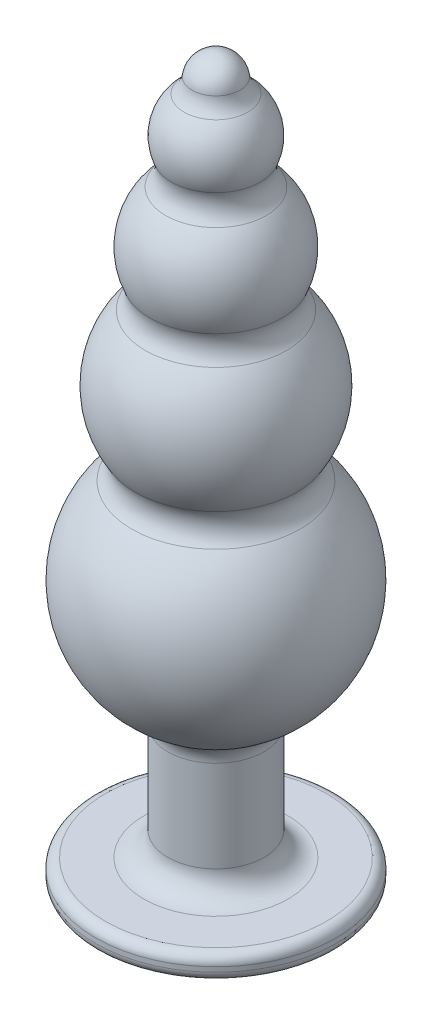
ISO-10303-21;
HEADER;
FILE_DESCRIPTION(('STEP AP214'),'2;1');
FILE_NAME('part.step','',(''),(''),'','','');
FILE_SCHEMA(('AUTOMOTIVE_DESIGN { 1 0 10303 214 1 1 1 1 }'));
ENDSEC;
DATA;
#1=APPLICATION_CONTEXT('core data for automotive mechanical design processes');
#2=APPLICATION_PROTOCOL_DEFINITION('international standard','automotive_design',2000,#1);
#3=PRODUCT_CONTEXT('',#1,'mechanical');
#4=PRODUCT('Part','Part','',(#3));
#5=PRODUCT_RELATED_PRODUCT_CATEGORY('part','',(#4));
#6=PRODUCT_DEFINITION_FORMATION('','',#4);
#7=PRODUCT_DEFINITION_CONTEXT('part definition',#1,'design');
#8=PRODUCT_DEFINITION('design','',#6,#7);
#9=PRODUCT_DEFINITION_SHAPE('','',#8);
#10=(LENGTH_UNIT() NAMED_UNIT(*) SI_UNIT(.MILLI.,.METRE.));
#11=(NAMED_UNIT(*) PLANE_ANGLE_UNIT() SI_UNIT($,.RADIAN.));
#12=(NAMED_UNIT(*) SI_UNIT($,.STERADIAN.) SOLID_ANGLE_UNIT());
#13=UNCERTAINTY_MEASURE_WITH_UNIT(LENGTH_MEASURE(1.E-05),#10,'distance_accuracy_value','');
#14=(GEOMETRIC_REPRESENTATION_CONTEXT(3) GLOBAL_UNCERTAINTY_ASSIGNED_CONTEXT((#13)) GLOBAL_UNIT_ASSIGNED_CONTEXT((#10,
#11,#12)) REPRESENTATION_CONTEXT('',''));
#15=CARTESIAN_POINT('',(0.,0.,0.));
#16=DIRECTION('',(0.,0.,1.));
#17=DIRECTION('',(1.,0.,0.));
#18=AXIS2_PLACEMENT_3D('',#15,#16,#17);
#19=CARTESIAN_POINT('',(0.,135.,0.));
#20=DIRECTION('',(0.,0.,-1.));
#21=DIRECTION('',(-1.,0.,0.));
#22=AXIS2_PLACEMENT_3D('',#19,#20,#21);
#23=SPHERICAL_SURFACE('',#22,10.);
#24=CARTESIAN_POINT('',(0.,135.,0.));
#25=DIRECTION('',(0.,1.,0.));
#26=DIRECTION('',(-1.,0.,0.));
#27=AXIS2_PLACEMENT_3D('',#24,#25,#26);
#28=SPHERICAL_SURFACE('',#27,10.);
#29=CARTESIAN_POINT('',(0.,131.25,0.));
#30=DIRECTION('',(0.,1.,0.));
#31=DIRECTION('',(-1.,0.,0.));
#32=AXIS2_PLACEMENT_3D('',#29,#30,#31);
#33=CIRCLE('',#32,9.27024810886958);
#34=CARTESIAN_POINT('',(-9.27024810886958,131.25,0.));
#35=VERTEX_POINT('',#34);
#36=EDGE_CURVE('E42',#35,#35,#33,.T.);
#37=ORIENTED_EDGE('',*,*,#36,.T.);
#38=EDGE_LOOP('',(#37));
#39=FACE_BOUND('',#38,.T.);
#40=CARTESIAN_POINT('',(0.,142.5,0.));
#41=DIRECTION('',(0.,-1.,0.));
#42=DIRECTION('',(1.,0.,0.));
#43=AXIS2_PLACEMENT_3D('',#40,#41,#42);
#44=CIRCLE('',#43,6.61437827766147);
#45=CARTESIAN_POINT('',(6.61437827766147,142.5,0.));
#46=VERTEX_POINT('',#45);
#47=EDGE_CURVE('E46',#46,#46,#44,.T.);
#48=ORIENTED_EDGE('',*,*,#47,.T.);
#49=EDGE_LOOP('',(#48));
#50=FACE_BOUND('',#49,.T.);
#51=ADVANCED_FACE('F35',(#39,#50),#28,.T.);
#52=CARTESIAN_POINT('',(0.,115.,0.));
#53=DIRECTION('',(0.,0.,-1.));
#54=DIRECTION('',(1.,0.,0.));
#55=AXIS2_PLACEMENT_3D('',#52,#53,#54);
#56=SPHERICAL_SURFACE('',#55,15.);
#57=CARTESIAN_POINT('',(0.,115.,0.));
#58=DIRECTION('',(0.,1.,0.));
#59=DIRECTION('',(-1.,0.,0.));
#60=AXIS2_PLACEMENT_3D('',#57,#58,#59);
#61=SPHERICAL_SURFACE('',#60,15.);
#62=CARTESIAN_POINT('',(0.,109.,0.));
#63=DIRECTION('',(0.,1.,0.));
#64=DIRECTION('',(-1.,0.,0.));
#65=AXIS2_PLACEMENT_3D('',#62,#63,#64);
#66=CIRCLE('',#65,13.7477270848675);
#67=CARTESIAN_POINT('',(-13.7477270848675,109.,0.));
#68=VERTEX_POINT('',#67);
#69=EDGE_CURVE('E50',#68,#68,#66,.T.);
#70=ORIENTED_EDGE('',*,*,#69,.T.);
#71=EDGE_LOOP('',(#70));
#72=FACE_BOUND('',#71,.T.);
#73=CARTESIAN_POINT('',(0.,125.78125,0.));
#74=DIRECTION('',(0.,-1.,0.));
#75=DIRECTION('',(1.,0.,0.));
#76=AXIS2_PLACEMENT_3D('',#73,#74,#75);
#77=CIRCLE('',#76,10.4290291224783);
#78=CARTESIAN_POINT('',(10.4290291224783,125.78125,0.));
#79=VERTEX_POINT('',#78);
#80=EDGE_CURVE('E55',#79,#79,#77,.T.);
#81=ORIENTED_EDGE('',*,*,#80,.T.);
#82=EDGE_LOOP('',(#81));
#83=FACE_BOUND('',#82,.T.);
#84=ADVANCED_FACE('F113',(#72,#83),#61,.T.);
#85=CARTESIAN_POINT('',(0.,90.,0.));
#86=DIRECTION('',(0.,0.,-1.));
#87=DIRECTION('',(1.,0.,0.));
#88=AXIS2_PLACEMENT_3D('',#85,#86,#87);
#89=SPHERICAL_SURFACE('',#88,20.);
#90=CARTESIAN_POINT('',(0.,90.,0.));
#91=DIRECTION('',(0.,1.,0.));
#92=DIRECTION('',(-1.,0.,0.));
#93=AXIS2_PLACEMENT_3D('',#90,#91,#92);
#94=SPHERICAL_SURFACE('',#93,20.);
#95=CARTESIAN_POINT('',(0.,79.1428571428571,0.));
#96=DIRECTION('',(0.,1.,0.));
#97=DIRECTION('',(-1.,0.,0.));
#98=AXIS2_PLACEMENT_3D('',#95,#96,#97);
#99=CIRCLE('',#98,16.7965010933704);
#100=CARTESIAN_POINT('',(-16.7965010933704,79.1428571428571,0.));
#101=VERTEX_POINT('',#100);
#102=EDGE_CURVE('E58',#101,#101,#99,.T.);
#103=ORIENTED_EDGE('',*,*,#102,.T.);
#104=EDGE_LOOP('',(#103));
#105=FACE_BOUND('',#104,.T.);
#106=CARTESIAN_POINT('',(0.,103.6,0.));
#107=DIRECTION('',(0.,-1.,0.));
#108=DIRECTION('',(1.,0.,0.));
#109=AXIS2_PLACEMENT_3D('',#106,#107,#108);
#110=CIRCLE('',#109,14.6642422238587);
#111=CARTESIAN_POINT('',(14.6642422238587,103.6,0.));
#112=VERTEX_POINT('',#111);
#113=EDGE_CURVE('E61',#112,#112,#110,.T.);
#114=ORIENTED_EDGE('',*,*,#113,.T.);
#115=EDGE_LOOP('',(#114));
#116=FACE_BOUND('',#115,.T.);
#117=ADVANCED_FACE('F118',(#105,#116),#94,.T.);
#118=CARTESIAN_POINT('',(0.,55.,0.));
#119=DIRECTION('',(0.,0.,-1.));
#120=DIRECTION('',(1.,0.,0.));
#121=AXIS2_PLACEMENT_3D('',#118,#119,#120);
#122=SPHERICAL_SURFACE('',#121,25.);
#123=CARTESIAN_POINT('',(0.,55.,0.));
#124=DIRECTION('',(0.,1.,0.));
#125=DIRECTION('',(0.,0.,1.));
#126=AXIS2_PLACEMENT_3D('',#123,#124,#125);
#127=SPHERICAL_SURFACE('',#126,25.);
#128=CARTESIAN_POINT('',(0.,33.349364905389,0.));
#129=DIRECTION('',(0.,1.,0.));
#130=DIRECTION('',(0.,0.,1.));
#131=AXIS2_PLACEMENT_3D('',#128,#129,#130);
#132=CIRCLE('',#131,12.5);
#133=CARTESIAN_POINT('',(0.,33.349364905389,12.5));
#134=VERTEX_POINT('',#133);
#135=EDGE_CURVE('E67',#134,#134,#132,.T.);
#136=ORIENTED_EDGE('',*,*,#135,.T.);
#137=EDGE_LOOP('',(#136));
#138=FACE_BOUND('',#137,.T.);
#139=CARTESIAN_POINT('',(0.,72.8571428571429,0.));
#140=DIRECTION('',(0.,-1.,0.));
#141=DIRECTION('',(1.,0.,0.));
#142=AXIS2_PLACEMENT_3D('',#139,#140,#141);
#143=CIRCLE('',#142,17.4963553055941);
#144=CARTESIAN_POINT('',(17.4963553055941,72.8571428571429,0.));
#145=VERTEX_POINT('',#144);
#146=EDGE_CURVE('E70',#145,#145,#143,.T.);
#147=ORIENTED_EDGE('',*,*,#146,.T.);
#148=EDGE_LOOP('',(#147));
#149=FACE_BOUND('',#148,.T.);
#150=ADVANCED_FACE('F127',(#138,#149),#127,.T.);
#151=CARTESIAN_POINT('',(0.,55.,0.));
#152=DIRECTION('',(0.,-1.,0.));
#153=DIRECTION('',(0.,0.,-1.));
#154=AXIS2_PLACEMENT_3D('',#151,#152,#153);
#155=CYLINDRICAL_SURFACE('',#154,10.);
#156=CARTESIAN_POINT('',(0.,29.0192378864668,0.));
#157=DIRECTION('',(0.,1.,0.));
#158=DIRECTION('',(0.,0.,1.));
#159=AXIS2_PLACEMENT_3D('',#156,#157,#158);
#160=CIRCLE('',#159,10.);
#161=CARTESIAN_POINT('',(0.,29.0192378864668,10.));
#162=VERTEX_POINT('',#161);
#163=EDGE_CURVE('E64',#162,#162,#160,.F.);
#164=ORIENTED_EDGE('',*,*,#163,.T.);
#165=EDGE_LOOP('',(#164));
#166=FACE_BOUND('',#165,.T.);
#167=CARTESIAN_POINT('',(0.,10.,0.));
#168=DIRECTION('',(0.,1.,0.));
#169=DIRECTION('',(0.,0.,1.));
#170=AXIS2_PLACEMENT_3D('',#167,#168,#169);
#171=CIRCLE('',#170,10.);
#172=CARTESIAN_POINT('',(0.,10.,10.));
#173=VERTEX_POINT('',#172);
#174=EDGE_CURVE('E88',#173,#173,#171,.T.);
#175=ORIENTED_EDGE('',*,*,#174,.T.);
#176=EDGE_LOOP('',(#175));
#177=FACE_BOUND('',#176,.T.);
#178=ADVANCED_FACE('F92',(#166,#177),#155,.T.);
#179=CARTESIAN_POINT('',(0.,5.,0.));
#180=DIRECTION('',(0.,-1.,0.));
#181=DIRECTION('',(0.,0.,-1.));
#182=AXIS2_PLACEMENT_3D('',#179,#180,#181);
#183=CYLINDRICAL_SURFACE('',#182,25.);
#184=CARTESIAN_POINT('',(0.,2.,0.));
#185=DIRECTION('',(0.,1.,0.));
#186=DIRECTION('',(0.,0.,1.));
#187=AXIS2_PLACEMENT_3D('',#184,#185,#186);
#188=CIRCLE('',#187,25.);
#189=CARTESIAN_POINT('',(0.,2.,25.));
#190=VERTEX_POINT('',#189);
#191=EDGE_CURVE('E79',#190,#190,#188,.T.);
#192=ORIENTED_EDGE('',*,*,#191,.T.);
#193=EDGE_LOOP('',(#192));
#194=FACE_BOUND('',#193,.T.);
#195=CARTESIAN_POINT('',(0.,3.,0.));
#196=DIRECTION('',(0.,1.,0.));
#197=DIRECTION('',(0.,0.,1.));
#198=AXIS2_PLACEMENT_3D('',#195,#196,#197);
#199=CIRCLE('',#198,25.);
#200=CARTESIAN_POINT('',(0.,3.,25.));
#201=VERTEX_POINT('',#200);
#202=EDGE_CURVE('E82',#201,#201,#199,.F.);
#203=ORIENTED_EDGE('',*,*,#202,.T.);
#204=EDGE_LOOP('',(#203));
#205=FACE_BOUND('',#204,.T.);
#206=ADVANCED_FACE('F134',(#194,#205),#183,.T.);
#207=CARTESIAN_POINT('',(0.,5.,0.));
#208=DIRECTION('',(0.,1.,0.));
#209=DIRECTION('',(0.,0.,1.));
#210=AXIS2_PLACEMENT_3D('',#207,#208,#209);
#211=PLANE('',#210);
#212=CARTESIAN_POINT('',(0.,5.,0.));
#213=DIRECTION('',(0.,1.,0.));
#214=DIRECTION('',(0.,0.,1.));
#215=AXIS2_PLACEMENT_3D('',#212,#213,#214);
#216=CIRCLE('',#215,23.);
#217=CARTESIAN_POINT('',(0.,5.,23.));
#218=VERTEX_POINT('',#217);
#219=EDGE_CURVE('E73',#218,#218,#216,.T.);
#220=ORIENTED_EDGE('',*,*,#219,.T.);
#221=EDGE_LOOP('',(#220));
#222=FACE_BOUND('',#221,.T.);
#223=CARTESIAN_POINT('',(0.,5.,0.));
#224=DIRECTION('',(0.,1.,0.));
#225=DIRECTION('',(0.,0.,1.));
#226=AXIS2_PLACEMENT_3D('',#223,#224,#225);
#227=CIRCLE('',#226,15.);
#228=CARTESIAN_POINT('',(0.,5.,15.));
#229=VERTEX_POINT('',#228);
#230=EDGE_CURVE('E85',#229,#229,#227,.F.);
#231=ORIENTED_EDGE('',*,*,#230,.T.);
#232=EDGE_LOOP('',(#231));
#233=FACE_BOUND('',#232,.T.);
#234=ADVANCED_FACE('F107',(#222,#233),#211,.T.);
#235=CARTESIAN_POINT('',(0.,0.,0.));
#236=DIRECTION('',(0.,1.,0.));
#237=DIRECTION('',(0.,0.,1.));
#238=AXIS2_PLACEMENT_3D('',#235,#236,#237);
#239=PLANE('',#238);
#240=CARTESIAN_POINT('',(0.,0.,0.));
#241=DIRECTION('',(0.,1.,0.));
#242=DIRECTION('',(0.,0.,1.));
#243=AXIS2_PLACEMENT_3D('',#240,#241,#242);
#244=CIRCLE('',#243,23.);
#245=CARTESIAN_POINT('',(0.,0.,23.));
#246=VERTEX_POINT('',#245);
#247=EDGE_CURVE('E76',#246,#246,#244,.F.);
#248=ORIENTED_EDGE('',*,*,#247,.T.);
#249=EDGE_LOOP('',(#248));
#250=FACE_BOUND('',#249,.T.);
#251=ADVANCED_FACE('F97',(#250),#239,.F.);
#252=CARTESIAN_POINT('',(0.,10.,0.));
#253=DIRECTION('',(0.,1.,0.));
#254=DIRECTION('',(0.,0.,1.));
#255=AXIS2_PLACEMENT_3D('',#252,#253,#254);
#256=TOROIDAL_SURFACE('',#255,15.,5.);
#257=ORIENTED_EDGE('',*,*,#230,.F.);
#258=EDGE_LOOP('',(#257));
#259=FACE_BOUND('',#258,.T.);
#260=ORIENTED_EDGE('',*,*,#174,.F.);
#261=EDGE_LOOP('',(#260));
#262=FACE_BOUND('',#261,.T.);
#263=ADVANCED_FACE('F94',(#259,#262),#256,.F.);
#264=CARTESIAN_POINT('',(0.,2.,0.));
#265=DIRECTION('',(0.,1.,0.));
#266=DIRECTION('',(0.,0.,1.));
#267=AXIS2_PLACEMENT_3D('',#264,#265,#266);
#268=TOROIDAL_SURFACE('',#267,23.,2.);
#269=ORIENTED_EDGE('',*,*,#247,.F.);
#270=EDGE_LOOP('',(#269));
#271=FACE_BOUND('',#270,.T.);
#272=ORIENTED_EDGE('',*,*,#191,.F.);
#273=EDGE_LOOP('',(#272));
#274=FACE_BOUND('',#273,.T.);
#275=ADVANCED_FACE('F96',(#271,#274),#268,.T.);
#276=CARTESIAN_POINT('',(0.,3.,0.));
#277=DIRECTION('',(0.,1.,0.));
#278=DIRECTION('',(0.,0.,1.));
#279=AXIS2_PLACEMENT_3D('',#276,#277,#278);
#280=TOROIDAL_SURFACE('',#279,23.,2.);
#281=ORIENTED_EDGE('',*,*,#202,.F.);
#282=EDGE_LOOP('',(#281));
#283=FACE_BOUND('',#282,.T.);
#284=ORIENTED_EDGE('',*,*,#219,.F.);
#285=EDGE_LOOP('',(#284));
#286=FACE_BOUND('',#285,.T.);
#287=ADVANCED_FACE('F104',(#283,#286),#280,.T.);
#288=CARTESIAN_POINT('',(0.,145.,0.));
#289=DIRECTION('',(0.,0.,-1.));
#290=DIRECTION('',(1.,0.,0.));
#291=AXIS2_PLACEMENT_3D('',#288,#289,#290);
#292=SPHERICAL_SURFACE('',#291,5.);
#293=CARTESIAN_POINT('',(0.,145.,0.));
#294=DIRECTION('',(0.,-1.,0.));
#295=DIRECTION('',(1.,0.,0.));
#296=AXIS2_PLACEMENT_3D('',#293,#294,#295);
#297=SPHERICAL_SURFACE('',#296,5.);
#298=CARTESIAN_POINT('',(0.,145.625,0.));
#299=DIRECTION('',(0.,-1.,0.));
#300=DIRECTION('',(1.,0.,0.));
#301=AXIS2_PLACEMENT_3D('',#298,#299,#300);
#302=CIRCLE('',#301,4.96078370824611);
#303=CARTESIAN_POINT('',(4.96078370824611,145.625,0.));
#304=VERTEX_POINT('',#303);
#305=EDGE_CURVE('E10',#304,#304,#302,.F.);
#306=ORIENTED_EDGE('',*,*,#305,.T.);
#307=EDGE_LOOP('',(#306));
#308=FACE_BOUND('',#307,.T.);
#309=ADVANCED_FACE('F123',(#308),#297,.T.);
#310=CARTESIAN_POINT('',(0.,29.0192378864668,0.));
#311=DIRECTION('',(0.,1.,0.));
#312=DIRECTION('',(0.,0.,1.));
#313=AXIS2_PLACEMENT_3D('',#310,#311,#312);
#314=TOROIDAL_SURFACE('',#313,15.,5.);
#315=ORIENTED_EDGE('',*,*,#163,.F.);
#316=EDGE_LOOP('',(#315));
#317=FACE_BOUND('',#316,.T.);
#318=ORIENTED_EDGE('',*,*,#135,.F.);
#319=EDGE_LOOP('',(#318));
#320=FACE_BOUND('',#319,.T.);
#321=ADVANCED_FACE('F154',(#317,#320),#314,.F.);
#322=CARTESIAN_POINT('',(0.,76.4285714285714,0.));
#323=DIRECTION('',(0.,-1.,0.));
#324=DIRECTION('',(1.,0.,0.));
#325=AXIS2_PLACEMENT_3D('',#322,#323,#324);
#326=TOROIDAL_SURFACE('',#325,20.995626366713,5.);
#327=ORIENTED_EDGE('',*,*,#146,.F.);
#328=EDGE_LOOP('',(#327));
#329=FACE_BOUND('',#328,.T.);
#330=ORIENTED_EDGE('',*,*,#102,.F.);
#331=EDGE_LOOP('',(#330));
#332=FACE_BOUND('',#331,.T.);
#333=ADVANCED_FACE('F158',(#329,#332),#326,.F.);
#334=CARTESIAN_POINT('',(0.,107.,0.));
#335=DIRECTION('',(0.,-1.,0.));
#336=DIRECTION('',(1.,0.,0.));
#337=AXIS2_PLACEMENT_3D('',#334,#335,#336);
#338=TOROIDAL_SURFACE('',#337,18.3303027798234,5.);
#339=ORIENTED_EDGE('',*,*,#113,.F.);
#340=EDGE_LOOP('',(#339));
#341=FACE_BOUND('',#340,.T.);
#342=ORIENTED_EDGE('',*,*,#69,.F.);
#343=EDGE_LOOP('',(#342));
#344=FACE_BOUND('',#343,.T.);
#345=ADVANCED_FACE('F162',(#341,#344),#338,.F.);
#346=CARTESIAN_POINT('',(0.,129.375,0.));
#347=DIRECTION('',(0.,-1.,0.));
#348=DIRECTION('',(1.,0.,0.));
#349=AXIS2_PLACEMENT_3D('',#346,#347,#348);
#350=TOROIDAL_SURFACE('',#349,13.9053721633044,5.);
#351=ORIENTED_EDGE('',*,*,#80,.F.);
#352=EDGE_LOOP('',(#351));
#353=FACE_BOUND('',#352,.T.);
#354=ORIENTED_EDGE('',*,*,#36,.F.);
#355=EDGE_LOOP('',(#354));
#356=FACE_BOUND('',#355,.T.);
#357=ADVANCED_FACE('F165',(#353,#356),#350,.F.);
#358=CARTESIAN_POINT('',(0.,146.25,0.));
#359=DIRECTION('',(0.,-1.,0.));
#360=DIRECTION('',(1.,0.,0.));
#361=AXIS2_PLACEMENT_3D('',#358,#359,#360);
#362=TOROIDAL_SURFACE('',#361,9.92156741649222,5.);
#363=ORIENTED_EDGE('',*,*,#47,.F.);
#364=EDGE_LOOP('',(#363));
#365=FACE_BOUND('',#364,.T.);
#366=ORIENTED_EDGE('',*,*,#305,.F.);
#367=EDGE_LOOP('',(#366));
#368=FACE_BOUND('',#367,.T.);
#369=ADVANCED_FACE('F37',(#365,#368),#362,.F.);
#370=CLOSED_SHELL('',(#51,#84,#117,#150,#178,#206,#234,#251,#263,#275,#287,#309,#321,#333,#345,
#357,#369));
#371=MANIFOLD_SOLID_BREP('B2',#370);
#372=ADVANCED_BREP_SHAPE_REPRESENTATION('',(#18,#371),#14);
#373=SHAPE_DEFINITION_REPRESENTATION(#9,#372);
ENDSEC;
END-ISO-10303-21;
